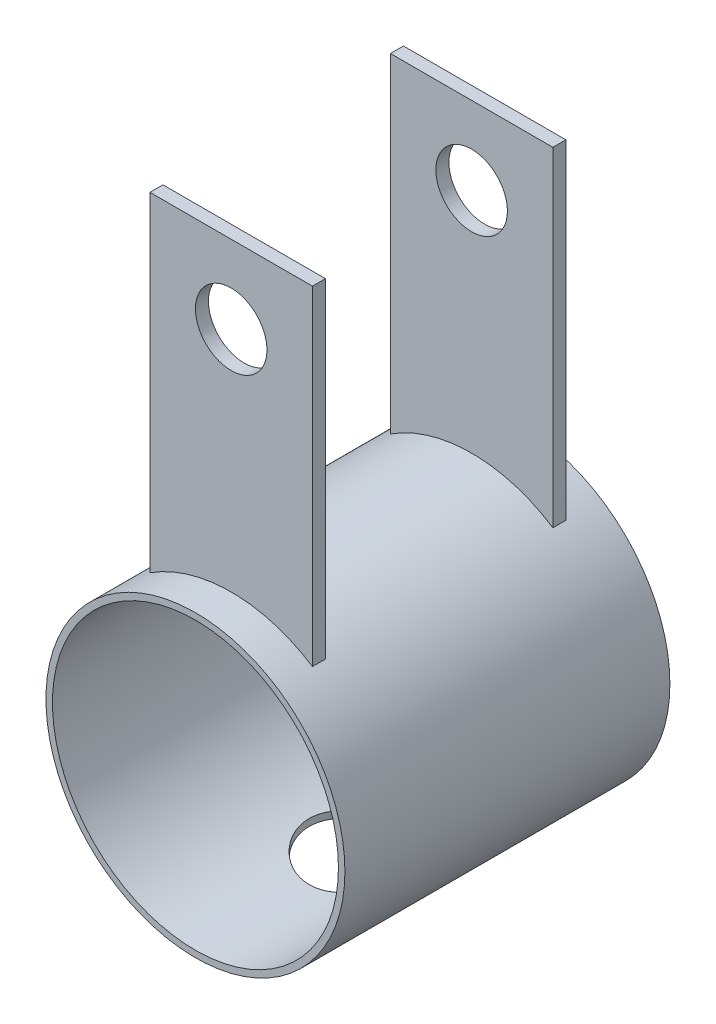
ISO-10303-21;
HEADER;
FILE_DESCRIPTION(('STEP AP214'),'2;1');
FILE_NAME('part.step','',(''),(''),'','','');
FILE_SCHEMA(('AUTOMOTIVE_DESIGN { 1 0 10303 214 1 1 1 1 }'));
ENDSEC;
DATA;
#1=APPLICATION_CONTEXT('core data for automotive mechanical design processes');
#2=APPLICATION_PROTOCOL_DEFINITION('international standard','automotive_design',2000,#1);
#3=PRODUCT_CONTEXT('',#1,'mechanical');
#4=PRODUCT('Part','Part','',(#3));
#5=PRODUCT_RELATED_PRODUCT_CATEGORY('part','',(#4));
#6=PRODUCT_DEFINITION_FORMATION('','',#4);
#7=PRODUCT_DEFINITION_CONTEXT('part definition',#1,'design');
#8=PRODUCT_DEFINITION('design','',#6,#7);
#9=PRODUCT_DEFINITION_SHAPE('','',#8);
#10=(LENGTH_UNIT() NAMED_UNIT(*) SI_UNIT(.MILLI.,.METRE.));
#11=(NAMED_UNIT(*) PLANE_ANGLE_UNIT() SI_UNIT($,.RADIAN.));
#12=(NAMED_UNIT(*) SI_UNIT($,.STERADIAN.) SOLID_ANGLE_UNIT());
#13=UNCERTAINTY_MEASURE_WITH_UNIT(LENGTH_MEASURE(1.E-05),#10,'distance_accuracy_value','');
#14=(GEOMETRIC_REPRESENTATION_CONTEXT(3) GLOBAL_UNCERTAINTY_ASSIGNED_CONTEXT((#13)) GLOBAL_UNIT_ASSIGNED_CONTEXT((#10,
#11,#12)) REPRESENTATION_CONTEXT('',''));
#15=CARTESIAN_POINT('',(0.,0.,0.));
#16=DIRECTION('',(0.,0.,1.));
#17=DIRECTION('',(1.,0.,0.));
#18=AXIS2_PLACEMENT_3D('',#15,#16,#17);
#19=CARTESIAN_POINT('',(0.,0.,50.));
#20=DIRECTION('',(0.,0.,-1.));
#21=DIRECTION('',(-1.,0.,0.));
#22=AXIS2_PLACEMENT_3D('',#19,#20,#21);
#23=CYLINDRICAL_SURFACE('',#22,23.);
#24=CARTESIAN_POINT('',(0.,0.,7.5));
#25=DIRECTION('',(0.,0.,1.));
#26=DIRECTION('',(1.,0.,0.));
#27=AXIS2_PLACEMENT_3D('',#24,#25,#26);
#28=CIRCLE('',#27,23.);
#29=CARTESIAN_POINT('',(12.5,19.3067345763078,7.5));
#30=VERTEX_POINT('',#29);
#31=CARTESIAN_POINT('',(-12.5,19.3067345763078,7.5));
#32=VERTEX_POINT('',#31);
#33=EDGE_CURVE('E154',#30,#32,#28,.T.);
#34=ORIENTED_EDGE('',*,*,#33,.T.);
#35=DIRECTION('',(0.,0.,-1.));
#36=VECTOR('',#35,1.);
#37=CARTESIAN_POINT('',(-12.5,19.3067345763078,50.));
#38=LINE('',#37,#36);
#39=CARTESIAN_POINT('',(-12.5,19.3067345763078,5.5));
#40=VERTEX_POINT('',#39);
#41=EDGE_CURVE('E133',#32,#40,#38,.T.);
#42=ORIENTED_EDGE('',*,*,#41,.T.);
#43=CARTESIAN_POINT('',(0.,0.,5.5));
#44=DIRECTION('',(0.,0.,-1.));
#45=DIRECTION('',(-1.,0.,0.));
#46=AXIS2_PLACEMENT_3D('',#43,#44,#45);
#47=CIRCLE('',#46,23.);
#48=CARTESIAN_POINT('',(12.5,19.3067345763078,5.5));
#49=VERTEX_POINT('',#48);
#50=EDGE_CURVE('E141',#40,#49,#47,.T.);
#51=ORIENTED_EDGE('',*,*,#50,.T.);
#52=DIRECTION('',(0.,0.,-1.));
#53=VECTOR('',#52,1.);
#54=CARTESIAN_POINT('',(12.5,19.3067345763078,50.));
#55=LINE('',#54,#53);
#56=EDGE_CURVE('E146',#49,#30,#55,.F.);
#57=ORIENTED_EDGE('',*,*,#56,.T.);
#58=EDGE_LOOP('',(#34,#42,#51,#57));
#59=FACE_BOUND('',#58,.T.);
#60=CARTESIAN_POINT('',(0.,0.,0.));
#61=DIRECTION('',(0.,0.,1.));
#62=DIRECTION('',(1.,0.,0.));
#63=AXIS2_PLACEMENT_3D('',#60,#61,#62);
#64=CIRCLE('',#63,23.);
#65=CARTESIAN_POINT('',(23.,0.,0.));
#66=VERTEX_POINT('',#65);
#67=EDGE_CURVE('E54',#66,#66,#64,.T.);
#68=ORIENTED_EDGE('',*,*,#67,.T.);
#69=EDGE_LOOP('',(#68));
#70=FACE_BOUND('',#69,.T.);
#71=CARTESIAN_POINT('',(0.,0.,50.));
#72=DIRECTION('',(0.,0.,1.));
#73=DIRECTION('',(1.,0.,0.));
#74=AXIS2_PLACEMENT_3D('',#71,#72,#73);
#75=CIRCLE('',#74,23.);
#76=CARTESIAN_POINT('',(23.,0.,50.));
#77=VERTEX_POINT('',#76);
#78=EDGE_CURVE('E11',#77,#77,#75,.T.);
#79=ORIENTED_EDGE('',*,*,#78,.F.);
#80=EDGE_LOOP('',(#79));
#81=FACE_BOUND('',#80,.T.);
#82=CARTESIAN_POINT('',(0.,-23.,32.5));
#83=CARTESIAN_POINT('',(0.204864398077825,-22.9999999701281,32.4999999544492));
#84=CARTESIAN_POINT('',(0.409729483335532,-22.9972565266355,32.4915993071833));
#85=CARTESIAN_POINT('',(0.817940430874261,-22.9863582353836,32.4580771636223));
#86=CARTESIAN_POINT('',(1.02128628688262,-22.9782033652937,32.4329555983277));
#87=CARTESIAN_POINT('',(1.42495892550965,-22.9567058474087,32.366229661763));
#88=CARTESIAN_POINT('',(1.6252859295165,-22.9433635819745,32.3246265053405));
#89=CARTESIAN_POINT('',(2.02158842545811,-22.9118466721847,32.2252981491143));
#90=CARTESIAN_POINT('',(2.21756221046589,-22.8936701673062,32.167566741701));
#91=CARTESIAN_POINT('',(2.60335795911659,-22.8530098099489,32.03661323981));
#92=CARTESIAN_POINT('',(2.7931916985559,-22.8305348542056,31.9634231089916));
#93=CARTESIAN_POINT('',(3.1659218811848,-22.7818424725911,31.8020759877481));
#94=CARTESIAN_POINT('',(3.34881568152042,-22.7556236387334,31.7139133641403));
#95=CARTESIAN_POINT('',(3.88522288796595,-22.6723519018028,31.4279834171268));
#96=CARTESIAN_POINT('',(4.22679727286563,-22.6106466799314,31.2086595103127));
#97=CARTESIAN_POINT('',(4.87908860045259,-22.4790745072885,30.7111975143055));
#98=CARTESIAN_POINT('',(5.18857101413069,-22.4090181188129,30.4314911568208));
#99=CARTESIAN_POINT('',(5.61483718599953,-22.3045987293917,29.9766405833901));
#100=CARTESIAN_POINT('',(5.75067195989005,-22.2698818523704,29.8190333975278));
#101=CARTESIAN_POINT('',(6.00887674600169,-22.2016035540914,29.4929488980275));
#102=CARTESIAN_POINT('',(6.13125172076029,-22.1680417101379,29.3244756272321));
#103=CARTESIAN_POINT('',(6.3649299456936,-22.1021000982874,28.9728418878896));
#104=CARTESIAN_POINT('',(6.47583140331334,-22.0697790315523,28.7894034902626));
#105=CARTESIAN_POINT('',(6.68168557230068,-22.0083305812686,28.4133561925363));
#106=CARTESIAN_POINT('',(6.77664417970125,-21.9792020184485,28.2207507166061));
#107=CARTESIAN_POINT('',(6.94987071561079,-21.9250436626736,27.8276200416096));
#108=CARTESIAN_POINT('',(7.02813914458365,-21.9000137468239,27.6270950802269));
#109=CARTESIAN_POINT('',(7.16728045909582,-21.8548724063505,27.2195596708368));
#110=CARTESIAN_POINT('',(7.22815409005887,-21.8347607709678,27.0125495011637));
#111=CARTESIAN_POINT('',(7.33023222511796,-21.8006994755901,26.6004045198862));
#112=CARTESIAN_POINT('',(7.37201049893139,-21.7865711586398,26.3954265460098));
#113=CARTESIAN_POINT('',(7.43832291674243,-21.7640203888555,25.9823926474931));
#114=CARTESIAN_POINT('',(7.46285780703575,-21.7555976890822,25.7743368564591));
#115=CARTESIAN_POINT('',(7.4944326485462,-21.7447409558839,25.3567963052872));
#116=CARTESIAN_POINT('',(7.50147683750906,-21.7423054718439,25.1473119036176));
#117=CARTESIAN_POINT('',(7.49800913723755,-21.7435016437975,24.7285088165617));
#118=CARTESIAN_POINT('',(7.48749771586201,-21.7471331381056,24.519190126908));
#119=CARTESIAN_POINT('',(7.44987197263706,-21.7600500423929,24.1114778984506));
#120=CARTESIAN_POINT('',(7.4235037903663,-21.7690812642626,23.9130068829405));
#121=CARTESIAN_POINT('',(7.3550479026826,-21.7923054200772,23.5190348113656));
#122=CARTESIAN_POINT('',(7.31295499148648,-21.8065000633686,23.3235347611904));
#123=CARTESIAN_POINT('',(7.21343613973692,-21.8396218801163,22.936951807289));
#124=CARTESIAN_POINT('',(7.15601449872671,-21.8585477264269,22.745867681249));
#125=CARTESIAN_POINT('',(7.02628566064451,-21.9005926009622,22.3692206310321));
#126=CARTESIAN_POINT('',(6.95397281727217,-21.9237132193228,22.1836598317718));
#127=CARTESIAN_POINT('',(6.79382414131515,-21.973873049864,21.8164995087054));
#128=CARTESIAN_POINT('',(6.7057690353252,-22.0009664903954,21.6350030906871));
#129=CARTESIAN_POINT('',(6.51552200339568,-22.0580560052445,21.2799800938184));
#130=CARTESIAN_POINT('',(6.41332524344255,-22.0880530710444,21.106456267356));
#131=CARTESIAN_POINT('',(6.19550466975803,-22.1501364063615,20.7684339967459));
#132=CARTESIAN_POINT('',(6.07988004419715,-22.182222802145,20.6039360991793));
#133=CARTESIAN_POINT('',(5.83593723218718,-22.2476466399192,20.2849004934379));
#134=CARTESIAN_POINT('',(5.70761861707233,-22.2809841241346,20.1303631219132));
#135=CARTESIAN_POINT('',(5.43232598794998,-22.3497416324748,19.8246513240222));
#136=CARTESIAN_POINT('',(5.28473971691789,-22.3851823788035,19.6740323061049));
#137=CARTESIAN_POINT('',(4.97739563893128,-22.4555198675406,19.3857401852122));
#138=CARTESIAN_POINT('',(4.8176417041142,-22.4904167787912,19.2480629946387));
#139=CARTESIAN_POINT('',(4.48683179272023,-22.5587427355938,18.9864462397804));
#140=CARTESIAN_POINT('',(4.3157705665263,-22.5921710871802,18.8625131289552));
#141=CARTESIAN_POINT('',(3.96355385109197,-22.6566166004235,18.6293780133665));
#142=CARTESIAN_POINT('',(3.78240238822226,-22.6876347121864,18.5201701913479));
#143=CARTESIAN_POINT('',(3.40932435647282,-22.7467032882799,18.3162789771487));
#144=CARTESIAN_POINT('',(3.21731109082556,-22.7747224286494,18.2217449717436));
#145=CARTESIAN_POINT('',(2.8255084990945,-22.8266408340333,18.0492954386801));
#146=CARTESIAN_POINT('',(2.6257222101517,-22.8505416887508,17.9713734958168));
#147=CARTESIAN_POINT('',(2.21975395287849,-22.8935438394362,17.8328045569355));
#148=CARTESIAN_POINT('',(2.01357243338107,-22.912645471373,17.7721563516325));
#149=CARTESIAN_POINT('',(1.59636212600199,-22.9454876401916,17.6687100039005));
#150=CARTESIAN_POINT('',(1.38533355107182,-22.9592284121233,17.6259110788543));
#151=CARTESIAN_POINT('',(0.968961929644398,-22.9804861176569,17.5599951894126));
#152=CARTESIAN_POINT('',(0.763748814581578,-22.9882387182572,17.5361318253778));
#153=CARTESIAN_POINT('',(0.351921722851339,-22.9982297181461,17.5054164080751));
#154=CARTESIAN_POINT('',(0.145307787867253,-23.0004682807966,17.4985638508356));
#155=CARTESIAN_POINT('',(-0.267735002897097,-22.9993688012776,17.5019357715684));
#156=CARTESIAN_POINT('',(-0.474163880904488,-22.9960315558907,17.5121578095823));
#157=CARTESIAN_POINT('',(-0.885312487277571,-22.9838751861242,17.5495750886292));
#158=CARTESIAN_POINT('',(-1.09003223163594,-22.9750561130976,17.5767701706616));
#159=CARTESIAN_POINT('',(-1.49061052505763,-22.9524989523748,17.6468867289817));
#160=CARTESIAN_POINT('',(-1.68655738986711,-22.9389040186238,17.6893513019068));
#161=CARTESIAN_POINT('',(-2.07413939735505,-22.9071117262602,17.789727250775));
#162=CARTESIAN_POINT('',(-2.26577307935494,-22.8889128332939,17.8476437767162));
#163=CARTESIAN_POINT('',(-2.6433580073612,-22.8483852066372,17.9784212729274));
#164=CARTESIAN_POINT('',(-2.8293107627117,-22.8260575812109,18.0512782333489));
#165=CARTESIAN_POINT('',(-3.19449757002501,-22.7778209071344,18.2114100508208));
#166=CARTESIAN_POINT('',(-3.37372905170509,-22.7519105057955,18.2986903558919));
#167=CARTESIAN_POINT('',(-3.72877072752962,-22.6964614904395,18.4894012957199));
#168=CARTESIAN_POINT('',(-3.90437974773982,-22.6668476878411,18.5931845642249));
#169=CARTESIAN_POINT('',(-4.24633985138765,-22.6052824810096,18.8145253333702));
#170=CARTESIAN_POINT('',(-4.41268771132593,-22.5733302717019,18.9320875863454));
#171=CARTESIAN_POINT('',(-4.73510596658522,-22.5079060781817,19.1801930853984));
#172=CARTESIAN_POINT('',(-4.89117546912445,-22.4744339623752,19.3107374566422));
#173=CARTESIAN_POINT('',(-5.19212261299557,-22.4068215881291,19.5839890308662));
#174=CARTESIAN_POINT('',(-5.33699997924745,-22.3726813132934,19.7266965326102));
#175=CARTESIAN_POINT('',(-5.62077646765426,-22.3031194570267,20.0299049276242));
#176=CARTESIAN_POINT('',(-5.75913925643339,-22.2677069350632,20.1909104107575));
#177=CARTESIAN_POINT('',(-6.02179429664564,-22.1981181963637,20.5241768474694));
#178=CARTESIAN_POINT('',(-6.1460912240825,-22.1639415713567,20.696434030361));
#179=CARTESIAN_POINT('',(-6.37985030842398,-22.097788949989,21.0512457668098));
#180=CARTESIAN_POINT('',(-6.48930638178491,-22.0658138587058,21.2338045000009));
#181=CARTESIAN_POINT('',(-6.69245611537725,-22.005051091617,21.607903980516));
#182=CARTESIAN_POINT('',(-6.78615632443825,-21.9762620932405,21.7994409535465));
#183=CARTESIAN_POINT('',(-6.95688423071991,-21.9228134814475,22.1898322556585));
#184=CARTESIAN_POINT('',(-7.03395002528407,-21.8981444621421,22.3886686172376));
#185=CARTESIAN_POINT('',(-7.17097155169386,-21.8536578206893,22.7925967976508));
#186=CARTESIAN_POINT('',(-7.23093416359697,-21.8338382482237,22.9976860642896));
#187=CARTESIAN_POINT('',(-7.33320816444159,-21.7997011251425,23.4126400995383));
#188=CARTESIAN_POINT('',(-7.37552226396384,-21.7853827296447,23.6225041295817));
#189=CARTESIAN_POINT('',(-7.4420790208139,-21.7627365428348,24.0453954939536));
#190=CARTESIAN_POINT('',(-7.4663225365011,-21.7544084669809,24.2584226775407));
#191=CARTESIAN_POINT('',(-7.49574097672057,-21.7442887157855,24.6753848916366));
#192=CARTESIAN_POINT('',(-7.50179626649647,-21.7421953088374,24.8792509704995));
#193=CARTESIAN_POINT('',(-7.4972848757701,-21.743751443038,25.2867757978861));
#194=CARTESIAN_POINT('',(-7.48671852743557,-21.7474008694216,25.4904345504716));
#195=CARTESIAN_POINT('',(-7.44906860168228,-21.760325603402,25.896022384878));
#196=CARTESIAN_POINT('',(-7.42198610588085,-21.7696005425923,26.097951579087));
#197=CARTESIAN_POINT('',(-7.35156304655139,-21.7934829736561,26.4986318377666));
#198=CARTESIAN_POINT('',(-7.30822242421128,-21.8080904848196,26.6973828907379));
#199=CARTESIAN_POINT('',(-7.20658334159779,-21.8418856286526,27.0868510153807));
#200=CARTESIAN_POINT('',(-7.14856185934451,-21.8609880352257,27.2776479385009));
#201=CARTESIAN_POINT('',(-7.01766954535154,-21.9033569020772,27.6536691060438));
#202=CARTESIAN_POINT('',(-6.94479377122529,-21.9266247479847,27.8388914720729));
#203=CARTESIAN_POINT('',(-6.78477960207665,-21.9766645945364,28.2025334416996));
#204=CARTESIAN_POINT('',(-6.69764368224833,-22.0034359868938,28.3809542192632));
#205=CARTESIAN_POINT('',(-6.50968746052728,-22.0597732027047,28.7300516232385));
#206=CARTESIAN_POINT('',(-6.40886224640708,-22.0893400281017,28.9007254402839));
#207=CARTESIAN_POINT('',(-6.18971185408284,-22.1517715327271,29.2402818245958));
#208=CARTESIAN_POINT('',(-6.07083044141912,-22.1847224838286,29.4087897094493));
#209=CARTESIAN_POINT('',(-5.81974188374734,-22.251909811877,29.7352952518903));
#210=CARTESIAN_POINT('',(-5.68753430301301,-22.2861462308319,29.8932925655326));
#211=CARTESIAN_POINT('',(-5.4105626034536,-22.3550034525514,30.1979038482372));
#212=CARTESIAN_POINT('',(-5.26579322918235,-22.3896244108614,30.3445130037776));
#213=CARTESIAN_POINT('',(-4.96466847013988,-22.4583148218903,30.6253390199508));
#214=CARTESIAN_POINT('',(-4.80831691577726,-22.4923844524403,30.7595599448755));
#215=CARTESIAN_POINT('',(-4.47889947137546,-22.5603363172559,31.019560141554));
#216=CARTESIAN_POINT('',(-4.3054285467286,-22.5941646327137,31.1448409928684));
#217=CARTESIAN_POINT('',(-3.94814929602251,-22.659326423807,31.3802718928423));
#218=CARTESIAN_POINT('',(-3.76434463397221,-22.6906607743205,31.4904272574145));
#219=CARTESIAN_POINT('',(-3.38756561357121,-22.7499617992438,31.6947985584331));
#220=CARTESIAN_POINT('',(-3.1945917492374,-22.7779286548007,31.7890153523708));
#221=CARTESIAN_POINT('',(-2.8008043020909,-22.8296938023001,31.9607201428511));
#222=CARTESIAN_POINT('',(-2.59999120750136,-22.8534923533376,32.0382091792331));
#223=CARTESIAN_POINT('',(-2.20399221774353,-22.8949708798703,32.1717135248709));
#224=CARTESIAN_POINT('',(-2.00917046640238,-22.9129284790516,32.2287240726969));
#225=CARTESIAN_POINT('',(-1.61519114769772,-22.9440666568276,32.3268247967548));
#226=CARTESIAN_POINT('',(-1.41603387493468,-22.9572475589333,32.3679160511649));
#227=CARTESIAN_POINT('',(-1.0148100453241,-22.9784792541637,32.4338067484938));
#228=CARTESIAN_POINT('',(-0.812744066357234,-22.9865310523008,32.4586093830844));
#229=CARTESIAN_POINT('',(-0.407118963933042,-22.9972914746197,32.4917061382457));
#230=CARTESIAN_POINT('',(-0.203559821194432,-23.0000000296817,32.5000000452607));
#231=CARTESIAN_POINT('',(0.,-23.,32.5));
#232=B_SPLINE_CURVE_WITH_KNOTS('',3,(#82,#83,#84,#85,#86,#87,#88,#89,#90,#91,#92,#93,#94,#95,
#96,#97,#98,#99,#100,#101,#102,#103,#104,#105,#106,#107,#108,#109,#110,#111,#112,#113,#114,#115,
#116,#117,#118,#119,#120,#121,#122,#123,#124,#125,#126,#127,#128,#129,#130,#131,#132,#133,#134,
#135,#136,#137,#138,#139,#140,#141,#142,#143,#144,#145,#146,#147,#148,#149,#150,#151,#152,#153,
#154,#155,#156,#157,#158,#159,#160,#161,#162,#163,#164,#165,#166,#167,#168,#169,#170,#171,#172,
#173,#174,#175,#176,#177,#178,#179,#180,#181,#182,#183,#184,#185,#186,#187,#188,#189,#190,#191,
#192,#193,#194,#195,#196,#197,#198,#199,#200,#201,#202,#203,#204,#205,#206,#207,#208,#209,#210,
#211,#212,#213,#214,#215,#216,#217,#218,#219,#220,#221,#222,#223,#224,#225,#226,#227,#228,#229,
#230,#231),.UNSPECIFIED.,.T.,.F.,(4,2,2,2,2,2,2,2,2,2,2,2,2,2,2,2,2,2,2,2,2,2,2,2,2,2,2,2,2,2,2,
2,2,2,2,2,2,2,2,2,2,2,2,2,2,2,2,2,2,2,2,2,2,2,2,2,2,2,2,2,2,2,2,2,2,2,2,2,2,2,2,2,2,2,4),(0.,
0.614404646009882,1.22881182740268,1.84317372966103,2.45777242049592,3.07111254650557,
3.68468394612879,4.91077132222685,6.17367447279854,6.80590909589126,7.43790983137009,
8.08745975937553,8.7367689371869,9.38605864237757,10.0353205192154,10.6635300947748,
11.2917124796733,11.919742650144,12.5477560838126,13.148306718899,13.7490563469823,
14.349637648008,14.9504470922643,15.5603902436782,16.1705424081739,16.7807314808171,
17.3909411660899,18.0316910860002,18.6722379440974,19.3130843053919,19.9536767526188,
20.600414557341,21.246902152229,21.8933444772373,22.5397584554411,23.1592135805642,
23.7786503531436,24.3979986158224,25.0173410766357,25.6195128108926,26.2218854948854,
26.8240967197693,27.426535935462,28.044211609229,28.6621009480715,29.2800438864069,
29.8980020076967,30.5429122612147,31.1876074893635,31.8325661962912,32.4772561638293,
33.120453569318,33.7633918711987,34.4062313897674,35.0490403712754,35.6601894192059,
36.2713262540553,36.882423070782,37.493522098109,38.0938548507754,38.6943876758614,
39.2948163742541,39.8954611010327,40.5212725577434,41.147104483279,41.7731995107393,
42.3990883952953,43.0482144920035,43.6971118636064,44.3459743135701,44.9947964169912,
45.6054416812058,46.2160455805486,46.8265297994508,47.437021915486),.UNSPECIFIED.);
#233=CARTESIAN_POINT('',(0.,-23.,32.5));
#234=VERTEX_POINT('',#233);
#235=EDGE_CURVE('E200',#234,#234,#232,.T.);
#236=ORIENTED_EDGE('',*,*,#235,.T.);
#237=EDGE_LOOP('',(#236));
#238=FACE_BOUND('',#237,.T.);
#239=CARTESIAN_POINT('',(0.,0.,42.5));
#240=DIRECTION('',(0.,0.,1.));
#241=DIRECTION('',(1.,0.,0.));
#242=AXIS2_PLACEMENT_3D('',#239,#240,#241);
#243=CIRCLE('',#242,23.);
#244=CARTESIAN_POINT('',(12.5,19.3067345763078,42.5));
#245=VERTEX_POINT('',#244);
#246=CARTESIAN_POINT('',(-12.5,19.3067345763078,42.5));
#247=VERTEX_POINT('',#246);
#248=EDGE_CURVE('E197',#245,#247,#243,.T.);
#249=ORIENTED_EDGE('',*,*,#248,.F.);
#250=DIRECTION('',(0.,0.,-1.));
#251=VECTOR('',#250,1.);
#252=CARTESIAN_POINT('',(12.5,19.3067345763078,50.));
#253=LINE('',#252,#251);
#254=CARTESIAN_POINT('',(12.5,19.3067345763078,44.5));
#255=VERTEX_POINT('',#254);
#256=EDGE_CURVE('E187',#255,#245,#253,.T.);
#257=ORIENTED_EDGE('',*,*,#256,.F.);
#258=CARTESIAN_POINT('',(0.,0.,44.5));
#259=DIRECTION('',(0.,0.,-1.));
#260=DIRECTION('',(-1.,0.,0.));
#261=AXIS2_PLACEMENT_3D('',#258,#259,#260);
#262=CIRCLE('',#261,23.);
#263=CARTESIAN_POINT('',(-12.5,19.3067345763078,44.5));
#264=VERTEX_POINT('',#263);
#265=EDGE_CURVE('E191',#264,#255,#262,.T.);
#266=ORIENTED_EDGE('',*,*,#265,.F.);
#267=DIRECTION('',(0.,0.,-1.));
#268=VECTOR('',#267,1.);
#269=CARTESIAN_POINT('',(-12.5,19.3067345763078,50.));
#270=LINE('',#269,#268);
#271=EDGE_CURVE('E70',#247,#264,#270,.F.);
#272=ORIENTED_EDGE('',*,*,#271,.F.);
#273=EDGE_LOOP('',(#249,#257,#266,#272));
#274=FACE_BOUND('',#273,.T.);
#275=ADVANCED_FACE('F39',(#59,#70,#81,#238,#274),#23,.T.);
#276=CARTESIAN_POINT('',(0.,0.,50.));
#277=DIRECTION('',(0.,0.,-1.));
#278=DIRECTION('',(-1.,0.,0.));
#279=AXIS2_PLACEMENT_3D('',#276,#277,#278);
#280=CYLINDRICAL_SURFACE('',#279,22.);
#281=CARTESIAN_POINT('',(0.,0.,0.));
#282=DIRECTION('',(0.,0.,1.));
#283=DIRECTION('',(1.,0.,0.));
#284=AXIS2_PLACEMENT_3D('',#281,#282,#283);
#285=CIRCLE('',#284,22.);
#286=CARTESIAN_POINT('',(22.,0.,0.));
#287=VERTEX_POINT('',#286);
#288=EDGE_CURVE('E207',#287,#287,#285,.T.);
#289=ORIENTED_EDGE('',*,*,#288,.F.);
#290=EDGE_LOOP('',(#289));
#291=FACE_BOUND('',#290,.T.);
#292=CARTESIAN_POINT('',(0.,0.,50.));
#293=DIRECTION('',(0.,0.,1.));
#294=DIRECTION('',(1.,0.,0.));
#295=AXIS2_PLACEMENT_3D('',#292,#293,#294);
#296=CIRCLE('',#295,22.);
#297=CARTESIAN_POINT('',(22.,0.,50.));
#298=VERTEX_POINT('',#297);
#299=EDGE_CURVE('E208',#298,#298,#296,.T.);
#300=ORIENTED_EDGE('',*,*,#299,.T.);
#301=EDGE_LOOP('',(#300));
#302=FACE_BOUND('',#301,.T.);
#303=CARTESIAN_POINT('',(0.,-22.,32.5));
#304=CARTESIAN_POINT('',(0.204306828495646,-22.0000001494581,32.5000002185132));
#305=CARTESIAN_POINT('',(0.408610382519935,-21.9971475610358,32.4916451171794));
#306=CARTESIAN_POINT('',(0.815771102953668,-21.985813798821,32.4583010359896));
#307=CARTESIAN_POINT('',(1.01862773037379,-21.9773306280381,32.4333061545172));
#308=CARTESIAN_POINT('',(1.42126446837239,-21.9549687207925,32.3669278322593));
#309=CARTESIAN_POINT('',(1.62104560000676,-21.9410918170282,32.3255499580457));
#310=CARTESIAN_POINT('',(2.01626180617415,-21.9083094883704,32.2267692674307));
#311=CARTESIAN_POINT('',(2.2116951737434,-21.8894021249601,32.1693602729202));
#312=CARTESIAN_POINT('',(2.5963973083212,-21.847107187426,32.0391669858062));
#313=CARTESIAN_POINT('',(2.78567830649377,-21.823729231007,31.966415665631));
#314=CARTESIAN_POINT('',(3.15735797762389,-21.7730633085152,31.8060321825946));
#315=CARTESIAN_POINT('',(3.33975420652253,-21.7457739701101,31.7183947948598));
#316=CARTESIAN_POINT('',(3.69647457649215,-21.6879857627263,31.5289251044443));
#317=CARTESIAN_POINT('',(3.87079893507584,-21.6574869803052,31.4270931845605));
#318=CARTESIAN_POINT('',(4.21036929119327,-21.5940415487637,31.2099444469037));
#319=CARTESIAN_POINT('',(4.37561491282334,-21.5610947984183,31.0946270713851));
#320=CARTESIAN_POINT('',(4.70132365038727,-21.4924673655282,30.8472835541794));
#321=CARTESIAN_POINT('',(4.86145460122856,-21.4567325472868,30.7148348842944));
#322=CARTESIAN_POINT('',(5.17003513167113,-21.3844767463222,30.4372597055798));
#323=CARTESIAN_POINT('',(5.31848826951736,-21.3479560074235,30.2921370871823));
#324=CARTESIAN_POINT('',(5.60296144762952,-21.2750651910773,29.9899802088394));
#325=CARTESIAN_POINT('',(5.73897433755723,-21.2386952116049,29.8329391922041));
#326=CARTESIAN_POINT('',(5.99757548896344,-21.1671227638791,29.5080135522819));
#327=CARTESIAN_POINT('',(6.12016859279571,-21.131919877713,29.3401328753397));
#328=CARTESIAN_POINT('',(6.35473569897824,-21.0625913412805,28.9891410223163));
#329=CARTESIAN_POINT('',(6.466266451669,-21.0285322441354,28.8057200362414));
#330=CARTESIAN_POINT('',(6.67337018101166,-20.9637283423322,28.4296064365936));
#331=CARTESIAN_POINT('',(6.76894908359417,-20.9329823084198,28.2369173004544));
#332=CARTESIAN_POINT('',(6.94339601564666,-20.8757678747493,27.8435096483478));
#333=CARTESIAN_POINT('',(7.02226491852303,-20.8492992514346,27.6427915526941));
#334=CARTESIAN_POINT('',(7.16256963175481,-20.8015166923502,27.2347558619229));
#335=CARTESIAN_POINT('',(7.224006267167,-20.7802025126315,27.0274385796569));
#336=CARTESIAN_POINT('',(7.32699984865459,-20.7441063278536,26.6151262065948));
#337=CARTESIAN_POINT('',(7.36917735453764,-20.729121796665,26.4103038266804));
#338=CARTESIAN_POINT('',(7.43630876035399,-20.7051343318475,25.9975127988665));
#339=CARTESIAN_POINT('',(7.46126349024683,-20.6961311099822,25.789544303071));
#340=CARTESIAN_POINT('',(7.49368614585537,-20.6844136107064,25.3721275027475));
#341=CARTESIAN_POINT('',(7.50115876501551,-20.6816976453501,25.1626796105445));
#342=CARTESIAN_POINT('',(7.49855038783964,-20.6826435839731,24.7439109148199));
#343=CARTESIAN_POINT('',(7.48846991697827,-20.6863052970282,24.5345901076814));
#344=CARTESIAN_POINT('',(7.45177574089562,-20.6995505173018,24.1278145191661));
#345=CARTESIAN_POINT('',(7.42598473773309,-20.7088392335852,23.9302752321643));
#346=CARTESIAN_POINT('',(7.35883867485487,-20.7327943812435,23.5381251426326));
#347=CARTESIAN_POINT('',(7.31747848364289,-20.7474625856195,23.3435153276537));
#348=CARTESIAN_POINT('',(7.21958052881828,-20.7817309446074,22.9586589233737));
#349=CARTESIAN_POINT('',(7.16304691823211,-20.8013297496022,22.768411155605));
#350=CARTESIAN_POINT('',(7.03524996182191,-20.8448989597121,22.3933695735019));
#351=CARTESIAN_POINT('',(6.96398101473891,-20.8688710268013,22.2085778637628));
#352=CARTESIAN_POINT('',(6.80600790159705,-20.9209292467831,21.8426898690308));
#353=CARTESIAN_POINT('',(6.71907174685214,-20.9490759198448,21.6617024207756));
#354=CARTESIAN_POINT('',(6.53118545240552,-21.0084107083522,21.3076017274629));
#355=CARTESIAN_POINT('',(6.43023052884685,-21.039599860948,21.1344911972641));
#356=CARTESIAN_POINT('',(6.21500442779764,-21.1041782433554,20.79717360322));
#357=CARTESIAN_POINT('',(6.10073222815018,-21.1375676419595,20.6329672242251));
#358=CARTESIAN_POINT('',(5.85959089389396,-21.2056805898317,20.3143717959002));
#359=CARTESIAN_POINT('',(5.73272129242014,-21.2404041885165,20.1599831107662));
#360=CARTESIAN_POINT('',(5.45981932468471,-21.3122348706819,19.8536684692454));
#361=CARTESIAN_POINT('',(5.31311678247761,-21.3493680057193,19.7023450052435));
#362=CARTESIAN_POINT('',(5.00748376110617,-21.4231138538417,19.4125640707858));
#363=CARTESIAN_POINT('',(4.84855712571956,-21.4597267262641,19.2741025859623));
#364=CARTESIAN_POINT('',(4.51932400470682,-21.531467757366,19.0108300589177));
#365=CARTESIAN_POINT('',(4.34901203878829,-21.5665951875572,18.8860256678257));
#366=CARTESIAN_POINT('',(3.99819753066057,-21.6343780933023,18.6510656663987));
#367=CARTESIAN_POINT('',(3.81769906688946,-21.6670345460909,18.5409042518031));
#368=CARTESIAN_POINT('',(3.44550830668523,-21.7293457516027,18.3348500841813));
#369=CARTESIAN_POINT('',(3.25371285289363,-21.7589625648705,18.2391319628447));
#370=CARTESIAN_POINT('',(2.86218836570707,-21.8139160673251,18.0643081664008));
#371=CARTESIAN_POINT('',(2.66246245663408,-21.8392544218106,17.9851960248421));
#372=CARTESIAN_POINT('',(2.2564593500687,-21.884928913274,17.8442638208395));
#373=CARTESIAN_POINT('',(2.0501827673692,-21.905265518118,17.7824421409631));
#374=CARTESIAN_POINT('',(1.63262897715892,-21.9403374273945,17.6766879519455));
#375=CARTESIAN_POINT('',(1.42135201207521,-21.955073002786,17.6327545774209));
#376=CARTESIAN_POINT('',(1.00508533777263,-21.9779725746602,17.5647964296725));
#377=CARTESIAN_POINT('',(0.800242020149529,-21.9864030621509,17.5399628805843));
#378=CARTESIAN_POINT('',(0.389052790865807,-21.9975210221437,17.5072588540647));
#379=CARTESIAN_POINT('',(0.182706929052588,-22.0002086843027,17.4993878164457));
#380=CARTESIAN_POINT('',(-0.229891306884664,-21.9997660160866,17.500686395902));
#381=CARTESIAN_POINT('',(-0.436143690589079,-21.9966365968533,17.5098533442814));
#382=CARTESIAN_POINT('',(-0.847023922090942,-21.9846489786936,17.5451314038763));
#383=CARTESIAN_POINT('',(-1.0516517875871,-21.975790842267,17.5712423302345));
#384=CARTESIAN_POINT('',(-1.45149823436824,-21.9529500756626,17.6390896569393));
#385=CARTESIAN_POINT('',(-1.64681250938206,-21.9391336725107,17.6803200549268));
#386=CARTESIAN_POINT('',(-2.03322509929433,-21.9067021982317,17.7781077053454));
#387=CARTESIAN_POINT('',(-2.22432199055871,-21.8880855328171,17.8346700502215));
#388=CARTESIAN_POINT('',(-2.60093795819394,-21.8465330941485,17.9626236432132));
#389=CARTESIAN_POINT('',(-2.78645851730736,-21.8235984810283,18.0340109087412));
#390=CARTESIAN_POINT('',(-3.15089694505572,-21.773968080912,18.1910912651026));
#391=CARTESIAN_POINT('',(-3.32981228365061,-21.7472708711857,18.2767897696439));
#392=CARTESIAN_POINT('',(-3.68457162481484,-21.6900223303291,18.4643095944267));
#393=CARTESIAN_POINT('',(-3.86020761180549,-21.6593874226969,18.5664988917508));
#394=CARTESIAN_POINT('',(-4.20235360405741,-21.5956135211168,18.7845838958051));
#395=CARTESIAN_POINT('',(-4.36886043533964,-21.5624736656677,18.9004843258818));
#396=CARTESIAN_POINT('',(-4.69174940451459,-21.4945274994889,19.1452131293754));
#397=CARTESIAN_POINT('',(-4.84813046326199,-21.4597210118247,19.2740428770044));
#398=CARTESIAN_POINT('',(-5.14986850094033,-21.3893165119534,19.5438277769373));
#399=CARTESIAN_POINT('',(-5.29522517188262,-21.3537184776688,19.6847832677639));
#400=CARTESIAN_POINT('',(-5.58076500628776,-21.2809257137553,19.9850216128647));
#401=CARTESIAN_POINT('',(-5.72036725535786,-21.2437361405122,20.144858835936));
#402=CARTESIAN_POINT('',(-5.98560228794375,-21.1705335932911,20.4758940164783));
#403=CARTESIAN_POINT('',(-6.11123966734159,-21.134520234989,20.6470882065413));
#404=CARTESIAN_POINT('',(-6.34778485749797,-21.0646824577178,20.9999058736812));
#405=CARTESIAN_POINT('',(-6.45868630139871,-21.0308589881346,21.1815338105669));
#406=CARTESIAN_POINT('',(-6.66482132139409,-20.9664450643343,21.5539257577118));
#407=CARTESIAN_POINT('',(-6.76006144029942,-20.9358532619476,21.7446859095937));
#408=CARTESIAN_POINT('',(-6.93408822301068,-20.8788602369339,22.1340180654973));
#409=CARTESIAN_POINT('',(-7.01288629319482,-20.8524561122514,22.3325845396126));
#410=CARTESIAN_POINT('',(-7.15337504718499,-20.8046806069255,22.7361844126276));
#411=CARTESIAN_POINT('',(-7.21507269623544,-20.7833071777449,22.9412151405327));
#412=CARTESIAN_POINT('',(-7.32078912175291,-20.7463054041981,23.3562558304563));
#413=CARTESIAN_POINT('',(-7.36481133924331,-20.7306759416562,23.5662648148773));
#414=CARTESIAN_POINT('',(-7.43473001122427,-20.7057039173645,23.9896452079508));
#415=CARTESIAN_POINT('',(-7.46062743664842,-20.6963610188484,24.203016435864));
#416=CARTESIAN_POINT('',(-7.4931186724778,-20.6846186561952,24.6198642569417));
#417=CARTESIAN_POINT('',(-7.5006746881606,-20.6818731705239,24.823256673753));
#418=CARTESIAN_POINT('',(-7.49923086350347,-20.6823968394937,25.2299734052873));
#419=CARTESIAN_POINT('',(-7.49023141187257,-20.6856658529191,25.4332977214972));
#420=CARTESIAN_POINT('',(-7.45576887682982,-20.6981120723805,25.8383450624621));
#421=CARTESIAN_POINT('',(-7.4303070088182,-20.7072888422537,26.0400682043171));
#422=CARTESIAN_POINT('',(-7.36317111054065,-20.7312560783322,26.440456968315));
#423=CARTESIAN_POINT('',(-7.32149703673454,-20.7460465596139,26.6391225822449));
#424=CARTESIAN_POINT('',(-7.22337294555033,-20.7804119782705,27.0278619009391));
#425=CARTESIAN_POINT('',(-7.1672522204043,-20.7998797169424,27.2180284332699));
#426=CARTESIAN_POINT('',(-7.04030158838265,-20.8431919129596,27.5929397411806));
#427=CARTESIAN_POINT('',(-6.96946678924234,-20.8670378256916,27.7776826901033));
#428=CARTESIAN_POINT('',(-6.81366563876729,-20.9184292719342,28.1405316076064));
#429=CARTESIAN_POINT('',(-6.72870176360072,-20.945974157025,28.3186387324543));
#430=CARTESIAN_POINT('',(-6.54520886461325,-21.0040353380256,28.6672968986524));
#431=CARTESIAN_POINT('',(-6.44667469178027,-21.0345527605199,28.8378450392552));
#432=CARTESIAN_POINT('',(-6.23199146999318,-21.0991801413973,29.1778584410361));
#433=CARTESIAN_POINT('',(-6.11524992309091,-21.1333899041251,29.3469308126758));
#434=CARTESIAN_POINT('',(-5.86841873294479,-21.2032571707637,29.674803252866));
#435=CARTESIAN_POINT('',(-5.73832443888386,-21.2389151764724,29.833599710659));
#436=CARTESIAN_POINT('',(-5.46561113594613,-21.3107243946762,30.1399567079556));
#437=CARTESIAN_POINT('',(-5.32299085092031,-21.3468756571067,30.28751609976));
#438=CARTESIAN_POINT('',(-5.02608184867421,-21.4187261071718,30.570508318086));
#439=CARTESIAN_POINT('',(-4.87179302109255,-21.4544252905269,30.7059410298867));
#440=CARTESIAN_POINT('',(-4.54576711720468,-21.5259144816779,30.9692306669478));
#441=CARTESIAN_POINT('',(-4.37357050989504,-21.5616460544173,31.0965352284531));
#442=CARTESIAN_POINT('',(-4.01863769691094,-21.6306083602673,31.3361169994372));
#443=CARTESIAN_POINT('',(-3.83590525215998,-21.6638399761307,31.4483995243112));
#444=CARTESIAN_POINT('',(-3.46098849144232,-21.726888776989,31.657146694719));
#445=CARTESIAN_POINT('',(-3.26880185485344,-21.7567051176335,31.7536074312046));
#446=CARTESIAN_POINT('',(-2.87641716437504,-21.8120484016285,31.9298235427266));
#447=CARTESIAN_POINT('',(-2.67622270864778,-21.837577245264,32.0095863224398));
#448=CARTESIAN_POINT('',(-2.27511959958032,-21.8829470528705,32.1496597271587));
#449=CARTESIAN_POINT('',(-2.0744013950803,-21.9029319632911,32.2104690324115));
#450=CARTESIAN_POINT('',(-1.66822331243048,-21.9376059019302,32.3151208113484));
#451=CARTESIAN_POINT('',(-1.46276542759694,-21.9522971147663,32.3589702846117));
#452=CARTESIAN_POINT('',(-1.04858442166121,-21.9759753524852,32.4293062186455));
#453=CARTESIAN_POINT('',(-0.839861502018706,-21.9849627278958,32.4557937463926));
#454=CARTESIAN_POINT('',(-0.420757875253617,-21.9969749145713,32.4911403467841));
#455=CARTESIAN_POINT('',(-0.210377201654537,-21.9999998461012,32.4999997749944));
#456=CARTESIAN_POINT('',(0.,-22.,32.5));
#457=B_SPLINE_CURVE_WITH_KNOTS('',3,(#303,#304,#305,#306,#307,#308,#309,#310,#311,#312,#313,
#314,#315,#316,#317,#318,#319,#320,#321,#322,#323,#324,#325,#326,#327,#328,#329,#330,#331,#332,
#333,#334,#335,#336,#337,#338,#339,#340,#341,#342,#343,#344,#345,#346,#347,#348,#349,#350,#351,
#352,#353,#354,#355,#356,#357,#358,#359,#360,#361,#362,#363,#364,#365,#366,#367,#368,#369,#370,
#371,#372,#373,#374,#375,#376,#377,#378,#379,#380,#381,#382,#383,#384,#385,#386,#387,#388,#389,
#390,#391,#392,#393,#394,#395,#396,#397,#398,#399,#400,#401,#402,#403,#404,#405,#406,#407,#408,
#409,#410,#411,#412,#413,#414,#415,#416,#417,#418,#419,#420,#421,#422,#423,#424,#425,#426,#427,
#428,#429,#430,#431,#432,#433,#434,#435,#436,#437,#438,#439,#440,#441,#442,#443,#444,#445,#446,
#447,#448,#449,#450,#451,#452,#453,#454,#455,#456),.UNSPECIFIED.,.T.,.F.,(4,2,2,2,2,2,2,2,2,2,2,
2,2,2,2,2,2,2,2,2,2,2,2,2,2,2,2,2,2,2,2,2,2,2,2,2,2,2,2,2,2,2,2,2,2,2,2,2,2,2,2,2,2,2,2,2,2,2,2,
2,2,2,2,2,2,2,2,2,2,2,2,2,2,2,2,2,4),(0.,0.61272510084955,1.22566763223779,1.83840207803946,
2.45137298748304,3.06303973720067,3.67492162165971,4.28678700812928,4.89867770972593,
5.53054117009712,6.16221134901547,6.7942423438124,7.42604452148049,8.07730219398849,
8.72831739056492,9.3792985511629,10.030248896146,10.6584147021731,11.286550234996,
11.9145171121144,12.5424651905489,13.1400607726672,13.737853490843,14.3354827572861,
14.9333396161588,15.540911003422,16.1486902341981,16.7565161453473,17.3643645911971,
18.0056452183185,18.6467250173145,19.2881156514125,19.9292512846784,20.5776060844647,
21.2257079413504,21.8737491513948,22.5217590073941,23.1405330984435,23.7592867541431,
24.3779435013118,24.996593499099,25.5961902295778,26.1959863582719,26.79562156485,
27.3954841196054,28.0112898970877,28.627308434576,29.243392516008,29.8594938026648,
30.5050932928913,31.1504796812687,31.7961440169704,32.4415379252732,33.0864826034577,
33.7311641991662,34.3757202284184,35.0202417265703,35.6301414467357,36.2400268471299,
36.8498672255662,37.4597092418271,38.056721730381,38.6539330375353,39.2510397914847,
39.8483737345628,40.4725440495362,41.0969325081496,41.7213846534678,42.3458427056092,
42.9963721124272,43.6466707237753,44.2971297614852,44.9472997405081,45.5785424647626,
46.209524386889,46.8404675284475,47.4713979434971),.UNSPECIFIED.);
#458=CARTESIAN_POINT('',(0.,-22.,32.5));
#459=VERTEX_POINT('',#458);
#460=EDGE_CURVE('E43',#459,#459,#457,.T.);
#461=ORIENTED_EDGE('',*,*,#460,.F.);
#462=EDGE_LOOP('',(#461));
#463=FACE_BOUND('',#462,.T.);
#464=ADVANCED_FACE('F219',(#291,#302,#463),#280,.F.);
#465=CARTESIAN_POINT('',(0.,0.,50.));
#466=DIRECTION('',(0.,0.,1.));
#467=DIRECTION('',(1.,0.,0.));
#468=AXIS2_PLACEMENT_3D('',#465,#466,#467);
#469=PLANE('',#468);
#470=ORIENTED_EDGE('',*,*,#78,.T.);
#471=EDGE_LOOP('',(#470));
#472=FACE_BOUND('',#471,.T.);
#473=ORIENTED_EDGE('',*,*,#299,.F.);
#474=EDGE_LOOP('',(#473));
#475=FACE_BOUND('',#474,.T.);
#476=ADVANCED_FACE('F224',(#472,#475),#469,.T.);
#477=CARTESIAN_POINT('',(0.,0.,0.));
#478=DIRECTION('',(0.,0.,1.));
#479=DIRECTION('',(1.,0.,0.));
#480=AXIS2_PLACEMENT_3D('',#477,#478,#479);
#481=PLANE('',#480);
#482=ORIENTED_EDGE('',*,*,#67,.F.);
#483=EDGE_LOOP('',(#482));
#484=FACE_BOUND('',#483,.T.);
#485=ORIENTED_EDGE('',*,*,#288,.T.);
#486=EDGE_LOOP('',(#485));
#487=FACE_BOUND('',#486,.T.);
#488=ADVANCED_FACE('F215',(#484,#487),#481,.F.);
#489=CARTESIAN_POINT('',(0.,-50.,25.));
#490=DIRECTION('',(0.,1.,0.));
#491=DIRECTION('',(0.,0.,1.));
#492=AXIS2_PLACEMENT_3D('',#489,#490,#491);
#493=CYLINDRICAL_SURFACE('',#492,7.5);
#494=ORIENTED_EDGE('',*,*,#460,.T.);
#495=EDGE_LOOP('',(#494));
#496=FACE_BOUND('',#495,.T.);
#497=ORIENTED_EDGE('',*,*,#235,.F.);
#498=EDGE_LOOP('',(#497));
#499=FACE_BOUND('',#498,.T.);
#500=ADVANCED_FACE('F210',(#496,#499),#493,.F.);
#501=CARTESIAN_POINT('',(-12.5,70.,42.5));
#502=DIRECTION('',(1.,0.,0.));
#503=DIRECTION('',(0.,0.,-1.));
#504=AXIS2_PLACEMENT_3D('',#501,#502,#503);
#505=PLANE('',#504);
#506=DIRECTION('',(0.,-1.,0.));
#507=VECTOR('',#506,1.);
#508=CARTESIAN_POINT('',(-12.5,70.,42.5));
#509=LINE('',#508,#507);
#510=CARTESIAN_POINT('',(-12.5,70.,42.5));
#511=VERTEX_POINT('',#510);
#512=EDGE_CURVE('E183',#511,#247,#509,.T.);
#513=ORIENTED_EDGE('',*,*,#512,.T.);
#514=ORIENTED_EDGE('',*,*,#271,.T.);
#515=DIRECTION('',(0.,-1.,0.));
#516=VECTOR('',#515,1.);
#517=CARTESIAN_POINT('',(-12.5,70.,44.5));
#518=LINE('',#517,#516);
#519=CARTESIAN_POINT('',(-12.5,70.,44.5));
#520=VERTEX_POINT('',#519);
#521=EDGE_CURVE('E179',#520,#264,#518,.T.);
#522=ORIENTED_EDGE('',*,*,#521,.F.);
#523=DIRECTION('',(0.,0.,1.));
#524=VECTOR('',#523,1.);
#525=CARTESIAN_POINT('',(-12.5,70.,42.5));
#526=LINE('',#525,#524);
#527=EDGE_CURVE('E162',#511,#520,#526,.T.);
#528=ORIENTED_EDGE('',*,*,#527,.F.);
#529=EDGE_LOOP('',(#513,#514,#522,#528));
#530=FACE_BOUND('',#529,.T.);
#531=ADVANCED_FACE('F214',(#530),#505,.F.);
#532=CARTESIAN_POINT('',(12.5,70.,44.5));
#533=DIRECTION('',(-1.,0.,0.));
#534=DIRECTION('',(0.,0.,1.));
#535=AXIS2_PLACEMENT_3D('',#532,#533,#534);
#536=PLANE('',#535);
#537=DIRECTION('',(0.,-1.,0.));
#538=VECTOR('',#537,1.);
#539=CARTESIAN_POINT('',(12.5,70.,44.5));
#540=LINE('',#539,#538);
#541=CARTESIAN_POINT('',(12.5,70.,44.5));
#542=VERTEX_POINT('',#541);
#543=EDGE_CURVE('E175',#542,#255,#540,.T.);
#544=ORIENTED_EDGE('',*,*,#543,.T.);
#545=ORIENTED_EDGE('',*,*,#256,.T.);
#546=DIRECTION('',(0.,-1.,0.));
#547=VECTOR('',#546,1.);
#548=CARTESIAN_POINT('',(12.5,70.,42.5));
#549=LINE('',#548,#547);
#550=CARTESIAN_POINT('',(12.5,70.,42.5));
#551=VERTEX_POINT('',#550);
#552=EDGE_CURVE('E171',#551,#245,#549,.T.);
#553=ORIENTED_EDGE('',*,*,#552,.F.);
#554=DIRECTION('',(0.,0.,-1.));
#555=VECTOR('',#554,1.);
#556=CARTESIAN_POINT('',(12.5,70.,44.5));
#557=LINE('',#556,#555);
#558=EDGE_CURVE('E168',#542,#551,#557,.T.);
#559=ORIENTED_EDGE('',*,*,#558,.F.);
#560=EDGE_LOOP('',(#544,#545,#553,#559));
#561=FACE_BOUND('',#560,.T.);
#562=ADVANCED_FACE('F248',(#561),#536,.F.);
#563=CARTESIAN_POINT('',(0.,70.,42.5));
#564=DIRECTION('',(0.,0.,1.));
#565=DIRECTION('',(1.,0.,0.));
#566=AXIS2_PLACEMENT_3D('',#563,#564,#565);
#567=PLANE('',#566);
#568=CARTESIAN_POINT('',(0.,58.,42.5));
#569=DIRECTION('',(0.,0.,1.));
#570=DIRECTION('',(1.,0.,0.));
#571=AXIS2_PLACEMENT_3D('',#568,#569,#570);
#572=CIRCLE('',#571,5.5);
#573=CARTESIAN_POINT('',(5.5,58.,42.5));
#574=VERTEX_POINT('',#573);
#575=EDGE_CURVE('E135',#574,#574,#572,.T.);
#576=ORIENTED_EDGE('',*,*,#575,.T.);
#577=EDGE_LOOP('',(#576));
#578=FACE_BOUND('',#577,.T.);
#579=ORIENTED_EDGE('',*,*,#552,.T.);
#580=ORIENTED_EDGE('',*,*,#248,.T.);
#581=ORIENTED_EDGE('',*,*,#512,.F.);
#582=DIRECTION('',(-1.,0.,0.));
#583=VECTOR('',#582,1.);
#584=CARTESIAN_POINT('',(12.5,70.,42.5));
#585=LINE('',#584,#583);
#586=EDGE_CURVE('E159',#551,#511,#585,.T.);
#587=ORIENTED_EDGE('',*,*,#586,.F.);
#588=EDGE_LOOP('',(#579,#580,#581,#587));
#589=FACE_BOUND('',#588,.T.);
#590=ADVANCED_FACE('F217',(#578,#589),#567,.F.);
#591=CARTESIAN_POINT('',(-12.5,70.,44.5));
#592=DIRECTION('',(0.,0.,-1.));
#593=DIRECTION('',(-1.,0.,0.));
#594=AXIS2_PLACEMENT_3D('',#591,#592,#593);
#595=PLANE('',#594);
#596=CARTESIAN_POINT('',(0.,58.,44.5));
#597=DIRECTION('',(0.,0.,-1.));
#598=DIRECTION('',(-1.,0.,0.));
#599=AXIS2_PLACEMENT_3D('',#596,#597,#598);
#600=CIRCLE('',#599,5.5);
#601=CARTESIAN_POINT('',(-5.5,58.,44.5));
#602=VERTEX_POINT('',#601);
#603=EDGE_CURVE('E304',#602,#602,#600,.T.);
#604=ORIENTED_EDGE('',*,*,#603,.T.);
#605=EDGE_LOOP('',(#604));
#606=FACE_BOUND('',#605,.T.);
#607=ORIENTED_EDGE('',*,*,#521,.T.);
#608=ORIENTED_EDGE('',*,*,#265,.T.);
#609=ORIENTED_EDGE('',*,*,#543,.F.);
#610=DIRECTION('',(1.,0.,0.));
#611=VECTOR('',#610,1.);
#612=CARTESIAN_POINT('',(-12.5,70.,44.5));
#613=LINE('',#612,#611);
#614=EDGE_CURVE('E165',#520,#542,#613,.T.);
#615=ORIENTED_EDGE('',*,*,#614,.F.);
#616=EDGE_LOOP('',(#607,#608,#609,#615));
#617=FACE_BOUND('',#616,.T.);
#618=ADVANCED_FACE('F258',(#606,#617),#595,.F.);
#619=CARTESIAN_POINT('',(0.,70.,0.));
#620=DIRECTION('',(0.,1.,0.));
#621=DIRECTION('',(0.,0.,1.));
#622=AXIS2_PLACEMENT_3D('',#619,#620,#621);
#623=PLANE('',#622);
#624=ORIENTED_EDGE('',*,*,#586,.T.);
#625=ORIENTED_EDGE('',*,*,#527,.T.);
#626=ORIENTED_EDGE('',*,*,#614,.T.);
#627=ORIENTED_EDGE('',*,*,#558,.T.);
#628=EDGE_LOOP('',(#624,#625,#626,#627));
#629=FACE_BOUND('',#628,.T.);
#630=ADVANCED_FACE('F254',(#629),#623,.T.);
#631=CARTESIAN_POINT('',(-12.5,70.,7.5));
#632=DIRECTION('',(-1.,0.,0.));
#633=DIRECTION('',(0.,0.,1.));
#634=AXIS2_PLACEMENT_3D('',#631,#632,#633);
#635=PLANE('',#634);
#636=ORIENTED_EDGE('',*,*,#41,.F.);
#637=DIRECTION('',(0.,-1.,0.));
#638=VECTOR('',#637,1.);
#639=CARTESIAN_POINT('',(-12.5,70.,7.5));
#640=LINE('',#639,#638);
#641=CARTESIAN_POINT('',(-12.5,70.,7.5));
#642=VERTEX_POINT('',#641);
#643=EDGE_CURVE('E115',#642,#32,#640,.T.);
#644=ORIENTED_EDGE('',*,*,#643,.F.);
#645=DIRECTION('',(0.,0.,-1.));
#646=VECTOR('',#645,1.);
#647=CARTESIAN_POINT('',(-12.5,70.,7.5));
#648=LINE('',#647,#646);
#649=CARTESIAN_POINT('',(-12.5,70.,5.5));
#650=VERTEX_POINT('',#649);
#651=EDGE_CURVE('E131',#642,#650,#648,.T.);
#652=ORIENTED_EDGE('',*,*,#651,.T.);
#653=DIRECTION('',(0.,-1.,0.));
#654=VECTOR('',#653,1.);
#655=CARTESIAN_POINT('',(-12.5,70.,5.5));
#656=LINE('',#655,#654);
#657=EDGE_CURVE('E125',#650,#40,#656,.T.);
#658=ORIENTED_EDGE('',*,*,#657,.T.);
#659=EDGE_LOOP('',(#636,#644,#652,#658));
#660=FACE_BOUND('',#659,.T.);
#661=ADVANCED_FACE('F129',(#660),#635,.T.);
#662=CARTESIAN_POINT('',(12.5,70.,5.5));
#663=DIRECTION('',(1.,0.,0.));
#664=DIRECTION('',(0.,0.,-1.));
#665=AXIS2_PLACEMENT_3D('',#662,#663,#664);
#666=PLANE('',#665);
#667=ORIENTED_EDGE('',*,*,#56,.F.);
#668=DIRECTION('',(0.,-1.,0.));
#669=VECTOR('',#668,1.);
#670=CARTESIAN_POINT('',(12.5,70.,5.5));
#671=LINE('',#670,#669);
#672=CARTESIAN_POINT('',(12.5,70.,5.5));
#673=VERTEX_POINT('',#672);
#674=EDGE_CURVE('E62',#673,#49,#671,.T.);
#675=ORIENTED_EDGE('',*,*,#674,.F.);
#676=DIRECTION('',(0.,0.,1.));
#677=VECTOR('',#676,1.);
#678=CARTESIAN_POINT('',(12.5,70.,5.5));
#679=LINE('',#678,#677);
#680=CARTESIAN_POINT('',(12.5,70.,7.5));
#681=VERTEX_POINT('',#680);
#682=EDGE_CURVE('E124',#673,#681,#679,.T.);
#683=ORIENTED_EDGE('',*,*,#682,.T.);
#684=DIRECTION('',(0.,-1.,0.));
#685=VECTOR('',#684,1.);
#686=CARTESIAN_POINT('',(12.5,70.,7.5));
#687=LINE('',#686,#685);
#688=EDGE_CURVE('E118',#681,#30,#687,.T.);
#689=ORIENTED_EDGE('',*,*,#688,.T.);
#690=EDGE_LOOP('',(#667,#675,#683,#689));
#691=FACE_BOUND('',#690,.T.);
#692=ADVANCED_FACE('F277',(#691),#666,.T.);
#693=CARTESIAN_POINT('',(0.,70.,7.5));
#694=DIRECTION('',(0.,0.,1.));
#695=DIRECTION('',(1.,0.,0.));
#696=AXIS2_PLACEMENT_3D('',#693,#694,#695);
#697=PLANE('',#696);
#698=CARTESIAN_POINT('',(0.,58.,7.50000000000001));
#699=DIRECTION('',(0.,0.,1.));
#700=DIRECTION('',(1.,0.,0.));
#701=AXIS2_PLACEMENT_3D('',#698,#699,#700);
#702=CIRCLE('',#701,5.5);
#703=CARTESIAN_POINT('',(5.5,58.,7.50000000000001));
#704=VERTEX_POINT('',#703);
#705=EDGE_CURVE('E297',#704,#704,#702,.T.);
#706=ORIENTED_EDGE('',*,*,#705,.F.);
#707=EDGE_LOOP('',(#706));
#708=FACE_BOUND('',#707,.T.);
#709=ORIENTED_EDGE('',*,*,#33,.F.);
#710=ORIENTED_EDGE('',*,*,#688,.F.);
#711=DIRECTION('',(-1.,0.,0.));
#712=VECTOR('',#711,1.);
#713=CARTESIAN_POINT('',(12.5,70.,7.5));
#714=LINE('',#713,#712);
#715=EDGE_CURVE('E112',#681,#642,#714,.T.);
#716=ORIENTED_EDGE('',*,*,#715,.T.);
#717=ORIENTED_EDGE('',*,*,#643,.T.);
#718=EDGE_LOOP('',(#709,#710,#716,#717));
#719=FACE_BOUND('',#718,.T.);
#720=ADVANCED_FACE('F114',(#708,#719),#697,.T.);
#721=CARTESIAN_POINT('',(-12.5,70.,5.5));
#722=DIRECTION('',(0.,0.,-1.));
#723=DIRECTION('',(-1.,0.,0.));
#724=AXIS2_PLACEMENT_3D('',#721,#722,#723);
#725=PLANE('',#724);
#726=CARTESIAN_POINT('',(0.,58.,5.5));
#727=DIRECTION('',(0.,0.,-1.));
#728=DIRECTION('',(-1.,0.,0.));
#729=AXIS2_PLACEMENT_3D('',#726,#727,#728);
#730=CIRCLE('',#729,5.5);
#731=CARTESIAN_POINT('',(-5.5,58.,5.5));
#732=VERTEX_POINT('',#731);
#733=EDGE_CURVE('E300',#732,#732,#730,.T.);
#734=ORIENTED_EDGE('',*,*,#733,.F.);
#735=EDGE_LOOP('',(#734));
#736=FACE_BOUND('',#735,.T.);
#737=ORIENTED_EDGE('',*,*,#50,.F.);
#738=ORIENTED_EDGE('',*,*,#657,.F.);
#739=DIRECTION('',(1.,0.,0.));
#740=VECTOR('',#739,1.);
#741=CARTESIAN_POINT('',(-12.5,70.,5.5));
#742=LINE('',#741,#740);
#743=EDGE_CURVE('E139',#650,#673,#742,.T.);
#744=ORIENTED_EDGE('',*,*,#743,.T.);
#745=ORIENTED_EDGE('',*,*,#674,.T.);
#746=EDGE_LOOP('',(#737,#738,#744,#745));
#747=FACE_BOUND('',#746,.T.);
#748=ADVANCED_FACE('F274',(#736,#747),#725,.T.);
#749=CARTESIAN_POINT('',(0.,70.,0.));
#750=DIRECTION('',(0.,-1.,0.));
#751=DIRECTION('',(0.,0.,-1.));
#752=AXIS2_PLACEMENT_3D('',#749,#750,#751);
#753=PLANE('',#752);
#754=ORIENTED_EDGE('',*,*,#651,.F.);
#755=ORIENTED_EDGE('',*,*,#715,.F.);
#756=ORIENTED_EDGE('',*,*,#682,.F.);
#757=ORIENTED_EDGE('',*,*,#743,.F.);
#758=EDGE_LOOP('',(#754,#755,#756,#757));
#759=FACE_BOUND('',#758,.T.);
#760=ADVANCED_FACE('F138',(#759),#753,.F.);
#761=CARTESIAN_POINT('',(0.,58.,75.5));
#762=DIRECTION('',(0.,0.,-1.));
#763=DIRECTION('',(-1.,0.,0.));
#764=AXIS2_PLACEMENT_3D('',#761,#762,#763);
#765=CYLINDRICAL_SURFACE('',#764,5.5);
#766=ORIENTED_EDGE('',*,*,#705,.T.);
#767=EDGE_LOOP('',(#766));
#768=FACE_BOUND('',#767,.T.);
#769=ORIENTED_EDGE('',*,*,#733,.T.);
#770=EDGE_LOOP('',(#769));
#771=FACE_BOUND('',#770,.T.);
#772=ADVANCED_FACE('F273',(#768,#771),#765,.F.);
#773=ORIENTED_EDGE('',*,*,#603,.F.);
#774=EDGE_LOOP('',(#773));
#775=FACE_BOUND('',#774,.T.);
#776=ORIENTED_EDGE('',*,*,#575,.F.);
#777=EDGE_LOOP('',(#776));
#778=FACE_BOUND('',#777,.T.);
#779=ADVANCED_FACE('F288',(#775,#778),#765,.F.);
#780=CLOSED_SHELL('',(#275,#464,#476,#488,#500,#531,#562,#590,#618,#630,#661,#692,#720,#748,
#760,#772,#779));
#781=MANIFOLD_SOLID_BREP('B2',#780);
#782=ADVANCED_BREP_SHAPE_REPRESENTATION('',(#18,#781),#14);
#783=SHAPE_DEFINITION_REPRESENTATION(#9,#782);
ENDSEC;
END-ISO-10303-21;
